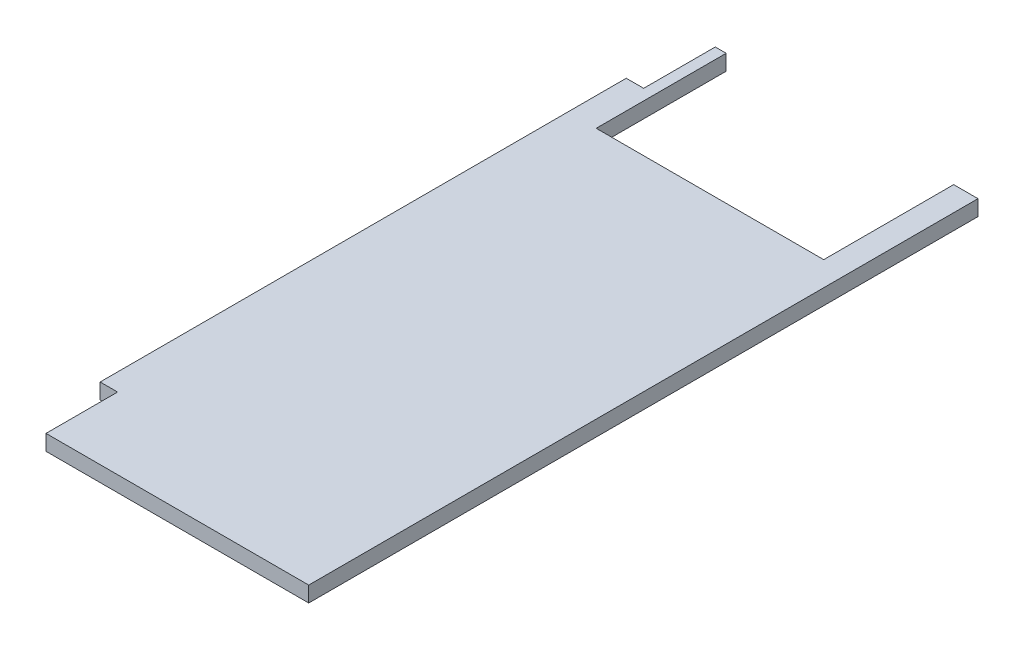
ISO-10303-21;
HEADER;
FILE_DESCRIPTION(('STEP AP214'),'2;1');
FILE_NAME('part.step','',(''),(''),'','','');
FILE_SCHEMA(('AUTOMOTIVE_DESIGN { 1 0 10303 214 1 1 1 1 }'));
ENDSEC;
DATA;
#1=APPLICATION_CONTEXT('core data for automotive mechanical design processes');
#2=APPLICATION_PROTOCOL_DEFINITION('international standard','automotive_design',2000,#1);
#3=PRODUCT_CONTEXT('',#1,'mechanical');
#4=PRODUCT('Part','Part','',(#3));
#5=PRODUCT_RELATED_PRODUCT_CATEGORY('part','',(#4));
#6=PRODUCT_DEFINITION_FORMATION('','',#4);
#7=PRODUCT_DEFINITION_CONTEXT('part definition',#1,'design');
#8=PRODUCT_DEFINITION('design','',#6,#7);
#9=PRODUCT_DEFINITION_SHAPE('','',#8);
#10=(LENGTH_UNIT() NAMED_UNIT(*) SI_UNIT(.MILLI.,.METRE.));
#11=(NAMED_UNIT(*) PLANE_ANGLE_UNIT() SI_UNIT($,.RADIAN.));
#12=(NAMED_UNIT(*) SI_UNIT($,.STERADIAN.) SOLID_ANGLE_UNIT());
#13=UNCERTAINTY_MEASURE_WITH_UNIT(LENGTH_MEASURE(1.E-05),#10,'distance_accuracy_value','');
#14=(GEOMETRIC_REPRESENTATION_CONTEXT(3) GLOBAL_UNCERTAINTY_ASSIGNED_CONTEXT((#13)) GLOBAL_UNIT_ASSIGNED_CONTEXT((#10,
#11,#12)) REPRESENTATION_CONTEXT('',''));
#15=CARTESIAN_POINT('',(0.,0.,0.));
#16=DIRECTION('',(0.,0.,1.));
#17=DIRECTION('',(1.,0.,0.));
#18=AXIS2_PLACEMENT_3D('',#15,#16,#17);
#19=CARTESIAN_POINT('',(0.,10.,-430.));
#20=DIRECTION('',(0.,0.,1.));
#21=DIRECTION('',(1.,0.,0.));
#22=AXIS2_PLACEMENT_3D('',#19,#20,#21);
#23=PLANE('',#22);
#24=DIRECTION('',(-1.,0.,0.));
#25=VECTOR('',#24,1.);
#26=CARTESIAN_POINT('',(0.,0.,-430.));
#27=LINE('',#26,#25);
#28=CARTESIAN_POINT('',(0.,0.,-430.));
#29=VERTEX_POINT('',#28);
#30=CARTESIAN_POINT('',(-15.6277566685219,0.,-430.));
#31=VERTEX_POINT('',#30);
#32=EDGE_CURVE('E153',#29,#31,#27,.T.);
#33=ORIENTED_EDGE('',*,*,#32,.T.);
#34=DIRECTION('',(0.,1.,0.));
#35=VECTOR('',#34,1.);
#36=CARTESIAN_POINT('',(-15.6277566685219,0.,-430.));
#37=LINE('',#36,#35);
#38=CARTESIAN_POINT('',(-15.6277566685219,10.,-430.));
#39=VERTEX_POINT('',#38);
#40=EDGE_CURVE('E209',#31,#39,#37,.T.);
#41=ORIENTED_EDGE('',*,*,#40,.T.);
#42=DIRECTION('',(-1.,0.,0.));
#43=VECTOR('',#42,1.);
#44=CARTESIAN_POINT('',(0.,10.,-430.));
#45=LINE('',#44,#43);
#46=CARTESIAN_POINT('',(0.,10.,-430.));
#47=VERTEX_POINT('',#46);
#48=EDGE_CURVE('E162',#47,#39,#45,.T.);
#49=ORIENTED_EDGE('',*,*,#48,.F.);
#50=DIRECTION('',(0.,-1.,0.));
#51=VECTOR('',#50,1.);
#52=CARTESIAN_POINT('',(0.,10.,-430.));
#53=LINE('',#52,#51);
#54=EDGE_CURVE('E11',#47,#29,#53,.T.);
#55=ORIENTED_EDGE('',*,*,#54,.T.);
#56=EDGE_LOOP('',(#33,#41,#49,#55));
#57=FACE_BOUND('',#56,.T.);
#58=ADVANCED_FACE('F35',(#57),#23,.F.);
#59=CARTESIAN_POINT('',(0.,10.,0.));
#60=DIRECTION('',(-1.,0.,0.));
#61=DIRECTION('',(0.,0.,1.));
#62=AXIS2_PLACEMENT_3D('',#59,#60,#61);
#63=PLANE('',#62);
#64=DIRECTION('',(0.,0.,-1.));
#65=VECTOR('',#64,1.);
#66=CARTESIAN_POINT('',(0.,0.,0.));
#67=LINE('',#66,#65);
#68=CARTESIAN_POINT('',(0.,0.,0.));
#69=VERTEX_POINT('',#68);
#70=EDGE_CURVE('E145',#69,#29,#67,.T.);
#71=ORIENTED_EDGE('',*,*,#70,.T.);
#72=ORIENTED_EDGE('',*,*,#54,.F.);
#73=DIRECTION('',(0.,0.,-1.));
#74=VECTOR('',#73,1.);
#75=CARTESIAN_POINT('',(0.,10.,0.));
#76=LINE('',#75,#74);
#77=CARTESIAN_POINT('',(0.,10.,0.));
#78=VERTEX_POINT('',#77);
#79=EDGE_CURVE('E146',#78,#47,#76,.T.);
#80=ORIENTED_EDGE('',*,*,#79,.F.);
#81=DIRECTION('',(0.,-1.,0.));
#82=VECTOR('',#81,1.);
#83=CARTESIAN_POINT('',(0.,10.,0.));
#84=LINE('',#83,#82);
#85=EDGE_CURVE('E43',#78,#69,#84,.T.);
#86=ORIENTED_EDGE('',*,*,#85,.T.);
#87=EDGE_LOOP('',(#71,#72,#80,#86));
#88=FACE_BOUND('',#87,.T.);
#89=ADVANCED_FACE('F37',(#88),#63,.F.);
#90=CARTESIAN_POINT('',(-161.799999974969,0.,-430.));
#91=VERTEX_POINT('',#90);
#92=CARTESIAN_POINT('',(-168.8,0.,-430.));
#93=VERTEX_POINT('',#92);
#94=EDGE_CURVE('E166',#91,#93,#27,.T.);
#95=ORIENTED_EDGE('',*,*,#94,.T.);
#96=DIRECTION('',(0.,1.,0.));
#97=VECTOR('',#96,1.);
#98=CARTESIAN_POINT('',(-168.8,0.,-430.));
#99=LINE('',#98,#97);
#100=CARTESIAN_POINT('',(-168.8,10.,-430.));
#101=VERTEX_POINT('',#100);
#102=EDGE_CURVE('E178',#93,#101,#99,.T.);
#103=ORIENTED_EDGE('',*,*,#102,.T.);
#104=CARTESIAN_POINT('',(-161.799999974969,10.,-430.));
#105=VERTEX_POINT('',#104);
#106=EDGE_CURVE('E150',#105,#101,#45,.T.);
#107=ORIENTED_EDGE('',*,*,#106,.F.);
#108=DIRECTION('',(0.,1.,0.));
#109=VECTOR('',#108,1.);
#110=CARTESIAN_POINT('',(-161.799999974969,0.,-430.));
#111=LINE('',#110,#109);
#112=EDGE_CURVE('E180',#91,#105,#111,.T.);
#113=ORIENTED_EDGE('',*,*,#112,.F.);
#114=EDGE_LOOP('',(#95,#103,#107,#113));
#115=FACE_BOUND('',#114,.T.);
#116=ADVANCED_FACE('F176',(#115),#23,.F.);
#117=CARTESIAN_POINT('',(-180.,10.,0.));
#118=DIRECTION('',(1.,0.,0.));
#119=DIRECTION('',(0.,0.,-1.));
#120=AXIS2_PLACEMENT_3D('',#117,#118,#119);
#121=PLANE('',#120);
#122=DIRECTION('',(0.,0.,1.));
#123=VECTOR('',#122,1.);
#124=CARTESIAN_POINT('',(-180.,0.,0.));
#125=LINE('',#124,#123);
#126=CARTESIAN_POINT('',(-180.,0.,-384.));
#127=VERTEX_POINT('',#126);
#128=CARTESIAN_POINT('',(-180.,0.,-46.));
#129=VERTEX_POINT('',#128);
#130=EDGE_CURVE('E147',#127,#129,#125,.T.);
#131=ORIENTED_EDGE('',*,*,#130,.T.);
#132=DIRECTION('',(0.,1.,0.));
#133=VECTOR('',#132,1.);
#134=CARTESIAN_POINT('',(-180.,0.,-46.));
#135=LINE('',#134,#133);
#136=CARTESIAN_POINT('',(-180.,10.,-46.));
#137=VERTEX_POINT('',#136);
#138=EDGE_CURVE('E197',#129,#137,#135,.T.);
#139=ORIENTED_EDGE('',*,*,#138,.T.);
#140=DIRECTION('',(0.,0.,1.));
#141=VECTOR('',#140,1.);
#142=CARTESIAN_POINT('',(-180.,10.,0.));
#143=LINE('',#142,#141);
#144=CARTESIAN_POINT('',(-180.,10.,-384.));
#145=VERTEX_POINT('',#144);
#146=EDGE_CURVE('E158',#145,#137,#143,.T.);
#147=ORIENTED_EDGE('',*,*,#146,.F.);
#148=DIRECTION('',(0.,1.,0.));
#149=VECTOR('',#148,1.);
#150=CARTESIAN_POINT('',(-180.,0.,-384.));
#151=LINE('',#150,#149);
#152=EDGE_CURVE('E187',#127,#145,#151,.T.);
#153=ORIENTED_EDGE('',*,*,#152,.F.);
#154=EDGE_LOOP('',(#131,#139,#147,#153));
#155=FACE_BOUND('',#154,.T.);
#156=ADVANCED_FACE('F242',(#155),#121,.F.);
#157=CARTESIAN_POINT('',(0.,10.,0.));
#158=DIRECTION('',(0.,0.,-1.));
#159=DIRECTION('',(-1.,0.,0.));
#160=AXIS2_PLACEMENT_3D('',#157,#158,#159);
#161=PLANE('',#160);
#162=DIRECTION('',(1.,0.,0.));
#163=VECTOR('',#162,1.);
#164=CARTESIAN_POINT('',(0.,10.,0.));
#165=LINE('',#164,#163);
#166=CARTESIAN_POINT('',(-168.8,10.,0.));
#167=VERTEX_POINT('',#166);
#168=EDGE_CURVE('E140',#167,#78,#165,.T.);
#169=ORIENTED_EDGE('',*,*,#168,.F.);
#170=DIRECTION('',(0.,1.,0.));
#171=VECTOR('',#170,1.);
#172=CARTESIAN_POINT('',(-168.8,0.,0.));
#173=LINE('',#172,#171);
#174=CARTESIAN_POINT('',(-168.8,0.,0.));
#175=VERTEX_POINT('',#174);
#176=EDGE_CURVE('E127',#175,#167,#173,.T.);
#177=ORIENTED_EDGE('',*,*,#176,.F.);
#178=DIRECTION('',(1.,0.,0.));
#179=VECTOR('',#178,1.);
#180=CARTESIAN_POINT('',(0.,0.,0.));
#181=LINE('',#180,#179);
#182=EDGE_CURVE('E138',#175,#69,#181,.T.);
#183=ORIENTED_EDGE('',*,*,#182,.T.);
#184=ORIENTED_EDGE('',*,*,#85,.F.);
#185=EDGE_LOOP('',(#169,#177,#183,#184));
#186=FACE_BOUND('',#185,.T.);
#187=ADVANCED_FACE('F136',(#186),#161,.F.);
#188=CARTESIAN_POINT('',(0.,10.,0.));
#189=DIRECTION('',(0.,1.,0.));
#190=DIRECTION('',(0.,0.,1.));
#191=AXIS2_PLACEMENT_3D('',#188,#189,#190);
#192=PLANE('',#191);
#193=DIRECTION('',(-1.,0.,0.));
#194=VECTOR('',#193,1.);
#195=CARTESIAN_POINT('',(-180.,10.,-46.));
#196=LINE('',#195,#194);
#197=CARTESIAN_POINT('',(-168.8,10.,-46.));
#198=VERTEX_POINT('',#197);
#199=EDGE_CURVE('E132',#198,#137,#196,.T.);
#200=ORIENTED_EDGE('',*,*,#199,.F.);
#201=DIRECTION('',(0.,0.,-1.));
#202=VECTOR('',#201,1.);
#203=CARTESIAN_POINT('',(-168.8,10.,0.));
#204=LINE('',#203,#202);
#205=EDGE_CURVE('E276',#167,#198,#204,.T.);
#206=ORIENTED_EDGE('',*,*,#205,.F.);
#207=ORIENTED_EDGE('',*,*,#168,.T.);
#208=ORIENTED_EDGE('',*,*,#79,.T.);
#209=ORIENTED_EDGE('',*,*,#48,.T.);
#210=DIRECTION('',(0.,0.,-1.));
#211=VECTOR('',#210,1.);
#212=CARTESIAN_POINT('',(-15.6277566685219,10.,-430.));
#213=LINE('',#212,#211);
#214=CARTESIAN_POINT('',(-15.6277566685219,10.,-346.500000000123));
#215=VERTEX_POINT('',#214);
#216=EDGE_CURVE('E200',#215,#39,#213,.T.);
#217=ORIENTED_EDGE('',*,*,#216,.F.);
#218=DIRECTION('',(1.,0.,0.));
#219=VECTOR('',#218,1.);
#220=CARTESIAN_POINT('',(-15.6277566685219,10.,-346.500000000123));
#221=LINE('',#220,#219);
#222=CARTESIAN_POINT('',(-161.799999974969,10.,-346.500000000123));
#223=VERTEX_POINT('',#222);
#224=EDGE_CURVE('E205',#223,#215,#221,.T.);
#225=ORIENTED_EDGE('',*,*,#224,.F.);
#226=DIRECTION('',(0.,0.,1.));
#227=VECTOR('',#226,1.);
#228=CARTESIAN_POINT('',(-161.799999974969,10.,-430.));
#229=LINE('',#228,#227);
#230=EDGE_CURVE('E211',#105,#223,#229,.T.);
#231=ORIENTED_EDGE('',*,*,#230,.F.);
#232=ORIENTED_EDGE('',*,*,#106,.T.);
#233=DIRECTION('',(0.,0.,-1.));
#234=VECTOR('',#233,1.);
#235=CARTESIAN_POINT('',(-168.8,10.,-430.));
#236=LINE('',#235,#234);
#237=CARTESIAN_POINT('',(-168.8,10.,-384.));
#238=VERTEX_POINT('',#237);
#239=EDGE_CURVE('E191',#238,#101,#236,.T.);
#240=ORIENTED_EDGE('',*,*,#239,.F.);
#241=DIRECTION('',(1.,0.,0.));
#242=VECTOR('',#241,1.);
#243=CARTESIAN_POINT('',(-180.,10.,-384.));
#244=LINE('',#243,#242);
#245=EDGE_CURVE('E194',#145,#238,#244,.T.);
#246=ORIENTED_EDGE('',*,*,#245,.F.);
#247=ORIENTED_EDGE('',*,*,#146,.T.);
#248=EDGE_LOOP('',(#200,#206,#207,#208,#209,#217,#225,#231,#232,#240,#246,#247));
#249=FACE_BOUND('',#248,.T.);
#250=ADVANCED_FACE('F225',(#249),#192,.T.);
#251=CARTESIAN_POINT('',(0.,0.,0.));
#252=DIRECTION('',(0.,1.,0.));
#253=DIRECTION('',(0.,0.,1.));
#254=AXIS2_PLACEMENT_3D('',#251,#252,#253);
#255=PLANE('',#254);
#256=DIRECTION('',(0.,0.,-1.));
#257=VECTOR('',#256,1.);
#258=CARTESIAN_POINT('',(-168.8,0.,0.));
#259=LINE('',#258,#257);
#260=CARTESIAN_POINT('',(-168.8,0.,-46.));
#261=VERTEX_POINT('',#260);
#262=EDGE_CURVE('E123',#175,#261,#259,.T.);
#263=ORIENTED_EDGE('',*,*,#262,.T.);
#264=DIRECTION('',(-1.,0.,0.));
#265=VECTOR('',#264,1.);
#266=CARTESIAN_POINT('',(-180.,0.,-46.));
#267=LINE('',#266,#265);
#268=EDGE_CURVE('E50',#261,#129,#267,.T.);
#269=ORIENTED_EDGE('',*,*,#268,.T.);
#270=ORIENTED_EDGE('',*,*,#130,.F.);
#271=DIRECTION('',(1.,0.,0.));
#272=VECTOR('',#271,1.);
#273=CARTESIAN_POINT('',(-180.,0.,-384.));
#274=LINE('',#273,#272);
#275=CARTESIAN_POINT('',(-168.8,0.,-384.));
#276=VERTEX_POINT('',#275);
#277=EDGE_CURVE('E186',#127,#276,#274,.T.);
#278=ORIENTED_EDGE('',*,*,#277,.T.);
#279=DIRECTION('',(0.,0.,-1.));
#280=VECTOR('',#279,1.);
#281=CARTESIAN_POINT('',(-168.8,0.,-430.));
#282=LINE('',#281,#280);
#283=EDGE_CURVE('E58',#276,#93,#282,.T.);
#284=ORIENTED_EDGE('',*,*,#283,.T.);
#285=ORIENTED_EDGE('',*,*,#94,.F.);
#286=DIRECTION('',(0.,0.,1.));
#287=VECTOR('',#286,1.);
#288=CARTESIAN_POINT('',(-161.799999974969,0.,-430.));
#289=LINE('',#288,#287);
#290=CARTESIAN_POINT('',(-161.799999974969,0.,-346.500000000123));
#291=VERTEX_POINT('',#290);
#292=EDGE_CURVE('E183',#91,#291,#289,.T.);
#293=ORIENTED_EDGE('',*,*,#292,.T.);
#294=DIRECTION('',(1.,0.,0.));
#295=VECTOR('',#294,1.);
#296=CARTESIAN_POINT('',(-15.6277566685219,0.,-346.500000000123));
#297=LINE('',#296,#295);
#298=CARTESIAN_POINT('',(-15.6277566685219,0.,-346.500000000123));
#299=VERTEX_POINT('',#298);
#300=EDGE_CURVE('E207',#291,#299,#297,.T.);
#301=ORIENTED_EDGE('',*,*,#300,.T.);
#302=DIRECTION('',(0.,0.,-1.));
#303=VECTOR('',#302,1.);
#304=CARTESIAN_POINT('',(-15.6277566685219,0.,-430.));
#305=LINE('',#304,#303);
#306=EDGE_CURVE('E202',#299,#31,#305,.T.);
#307=ORIENTED_EDGE('',*,*,#306,.T.);
#308=ORIENTED_EDGE('',*,*,#32,.F.);
#309=ORIENTED_EDGE('',*,*,#70,.F.);
#310=ORIENTED_EDGE('',*,*,#182,.F.);
#311=EDGE_LOOP('',(#263,#269,#270,#278,#284,#285,#293,#301,#307,#308,#309,#310));
#312=FACE_BOUND('',#311,.T.);
#313=ADVANCED_FACE('F143',(#312),#255,.F.);
#314=CARTESIAN_POINT('',(-15.6277566685219,0.,-430.));
#315=DIRECTION('',(1.,0.,0.));
#316=DIRECTION('',(0.,0.,-1.));
#317=AXIS2_PLACEMENT_3D('',#314,#315,#316);
#318=PLANE('',#317);
#319=ORIENTED_EDGE('',*,*,#216,.T.);
#320=ORIENTED_EDGE('',*,*,#40,.F.);
#321=ORIENTED_EDGE('',*,*,#306,.F.);
#322=DIRECTION('',(0.,1.,0.));
#323=VECTOR('',#322,1.);
#324=CARTESIAN_POINT('',(-15.6277566685219,0.,-346.500000000123));
#325=LINE('',#324,#323);
#326=EDGE_CURVE('E167',#299,#215,#325,.T.);
#327=ORIENTED_EDGE('',*,*,#326,.T.);
#328=EDGE_LOOP('',(#319,#320,#321,#327));
#329=FACE_BOUND('',#328,.T.);
#330=ADVANCED_FACE('F235',(#329),#318,.F.);
#331=CARTESIAN_POINT('',(-15.6277566685219,0.,-346.500000000123));
#332=DIRECTION('',(0.,0.,1.));
#333=DIRECTION('',(1.,0.,0.));
#334=AXIS2_PLACEMENT_3D('',#331,#332,#333);
#335=PLANE('',#334);
#336=ORIENTED_EDGE('',*,*,#224,.T.);
#337=ORIENTED_EDGE('',*,*,#326,.F.);
#338=ORIENTED_EDGE('',*,*,#300,.F.);
#339=DIRECTION('',(0.,1.,0.));
#340=VECTOR('',#339,1.);
#341=CARTESIAN_POINT('',(-161.799999974969,0.,-346.500000000123));
#342=LINE('',#341,#340);
#343=EDGE_CURVE('E217',#291,#223,#342,.T.);
#344=ORIENTED_EDGE('',*,*,#343,.T.);
#345=EDGE_LOOP('',(#336,#337,#338,#344));
#346=FACE_BOUND('',#345,.T.);
#347=ADVANCED_FACE('F232',(#346),#335,.F.);
#348=CARTESIAN_POINT('',(-161.799999974969,0.,-430.));
#349=DIRECTION('',(-1.,0.,0.));
#350=DIRECTION('',(0.,0.,1.));
#351=AXIS2_PLACEMENT_3D('',#348,#349,#350);
#352=PLANE('',#351);
#353=ORIENTED_EDGE('',*,*,#230,.T.);
#354=ORIENTED_EDGE('',*,*,#343,.F.);
#355=ORIENTED_EDGE('',*,*,#292,.F.);
#356=ORIENTED_EDGE('',*,*,#112,.T.);
#357=EDGE_LOOP('',(#353,#354,#355,#356));
#358=FACE_BOUND('',#357,.T.);
#359=ADVANCED_FACE('F230',(#358),#352,.F.);
#360=CARTESIAN_POINT('',(-168.8,0.,-430.));
#361=DIRECTION('',(1.,0.,0.));
#362=DIRECTION('',(0.,0.,-1.));
#363=AXIS2_PLACEMENT_3D('',#360,#361,#362);
#364=PLANE('',#363);
#365=ORIENTED_EDGE('',*,*,#239,.T.);
#366=ORIENTED_EDGE('',*,*,#102,.F.);
#367=ORIENTED_EDGE('',*,*,#283,.F.);
#368=DIRECTION('',(0.,1.,0.));
#369=VECTOR('',#368,1.);
#370=CARTESIAN_POINT('',(-168.8,0.,-384.));
#371=LINE('',#370,#369);
#372=EDGE_CURVE('E189',#276,#238,#371,.T.);
#373=ORIENTED_EDGE('',*,*,#372,.T.);
#374=EDGE_LOOP('',(#365,#366,#367,#373));
#375=FACE_BOUND('',#374,.T.);
#376=ADVANCED_FACE('F260',(#375),#364,.F.);
#377=CARTESIAN_POINT('',(-180.,0.,-384.));
#378=DIRECTION('',(0.,0.,1.));
#379=DIRECTION('',(1.,0.,0.));
#380=AXIS2_PLACEMENT_3D('',#377,#378,#379);
#381=PLANE('',#380);
#382=ORIENTED_EDGE('',*,*,#245,.T.);
#383=ORIENTED_EDGE('',*,*,#372,.F.);
#384=ORIENTED_EDGE('',*,*,#277,.F.);
#385=ORIENTED_EDGE('',*,*,#152,.T.);
#386=EDGE_LOOP('',(#382,#383,#384,#385));
#387=FACE_BOUND('',#386,.T.);
#388=ADVANCED_FACE('F263',(#387),#381,.F.);
#389=CARTESIAN_POINT('',(-180.,0.,-46.));
#390=DIRECTION('',(0.,0.,-1.));
#391=DIRECTION('',(-1.,0.,0.));
#392=AXIS2_PLACEMENT_3D('',#389,#390,#391);
#393=PLANE('',#392);
#394=ORIENTED_EDGE('',*,*,#199,.T.);
#395=ORIENTED_EDGE('',*,*,#138,.F.);
#396=ORIENTED_EDGE('',*,*,#268,.F.);
#397=DIRECTION('',(0.,1.,0.));
#398=VECTOR('',#397,1.);
#399=CARTESIAN_POINT('',(-168.8,0.,-46.));
#400=LINE('',#399,#398);
#401=EDGE_CURVE('E129',#261,#198,#400,.T.);
#402=ORIENTED_EDGE('',*,*,#401,.T.);
#403=EDGE_LOOP('',(#394,#395,#396,#402));
#404=FACE_BOUND('',#403,.T.);
#405=ADVANCED_FACE('F266',(#404),#393,.F.);
#406=CARTESIAN_POINT('',(-168.8,0.,0.));
#407=DIRECTION('',(1.,0.,0.));
#408=DIRECTION('',(0.,0.,-1.));
#409=AXIS2_PLACEMENT_3D('',#406,#407,#408);
#410=PLANE('',#409);
#411=ORIENTED_EDGE('',*,*,#205,.T.);
#412=ORIENTED_EDGE('',*,*,#401,.F.);
#413=ORIENTED_EDGE('',*,*,#262,.F.);
#414=ORIENTED_EDGE('',*,*,#176,.T.);
#415=EDGE_LOOP('',(#411,#412,#413,#414));
#416=FACE_BOUND('',#415,.T.);
#417=ADVANCED_FACE('F126',(#416),#410,.F.);
#418=CLOSED_SHELL('',(#58,#89,#116,#156,#187,#250,#313,#330,#347,#359,#376,#388,#405,#417));
#419=MANIFOLD_SOLID_BREP('B2',#418);
#420=ADVANCED_BREP_SHAPE_REPRESENTATION('',(#18,#419),#14);
#421=SHAPE_DEFINITION_REPRESENTATION(#9,#420);
ENDSEC;
END-ISO-10303-21;
